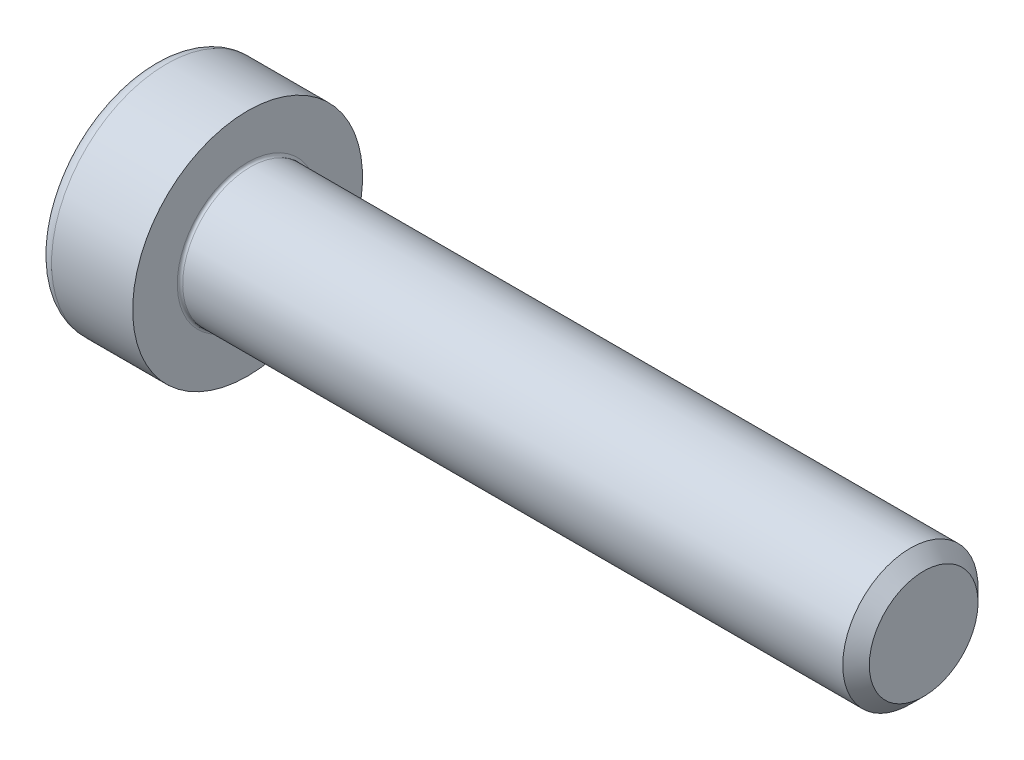
ISO-10303-21;
HEADER;
FILE_DESCRIPTION(('STEP AP214'),'2;1');
FILE_NAME('part.step','',(''),(''),'','','');
FILE_SCHEMA(('AUTOMOTIVE_DESIGN { 1 0 10303 214 1 1 1 1 }'));
ENDSEC;
DATA;
#1=APPLICATION_CONTEXT('core data for automotive mechanical design processes');
#2=APPLICATION_PROTOCOL_DEFINITION('international standard','automotive_design',2000,#1);
#3=PRODUCT_CONTEXT('',#1,'mechanical');
#4=PRODUCT('Part','Part','',(#3));
#5=PRODUCT_RELATED_PRODUCT_CATEGORY('part','',(#4));
#6=PRODUCT_DEFINITION_FORMATION('','',#4);
#7=PRODUCT_DEFINITION_CONTEXT('part definition',#1,'design');
#8=PRODUCT_DEFINITION('design','',#6,#7);
#9=PRODUCT_DEFINITION_SHAPE('','',#8);
#10=(LENGTH_UNIT() NAMED_UNIT(*) SI_UNIT(.MILLI.,.METRE.));
#11=(NAMED_UNIT(*) PLANE_ANGLE_UNIT() SI_UNIT($,.RADIAN.));
#12=(NAMED_UNIT(*) SI_UNIT($,.STERADIAN.) SOLID_ANGLE_UNIT());
#13=UNCERTAINTY_MEASURE_WITH_UNIT(LENGTH_MEASURE(1.E-05),#10,'distance_accuracy_value','');
#14=(GEOMETRIC_REPRESENTATION_CONTEXT(3) GLOBAL_UNCERTAINTY_ASSIGNED_CONTEXT((#13)) GLOBAL_UNIT_ASSIGNED_CONTEXT((#10,
#11,#12)) REPRESENTATION_CONTEXT('',''));
#15=CARTESIAN_POINT('',(0.,0.,0.));
#16=DIRECTION('',(0.,0.,1.));
#17=DIRECTION('',(1.,0.,0.));
#18=AXIS2_PLACEMENT_3D('',#15,#16,#17);
#19=CARTESIAN_POINT('',(-3.5,-1.5,0.866025403784439));
#20=DIRECTION('',(0.,-0.5,0.866025403784439));
#21=DIRECTION('',(0.,-0.866025403784439,-0.5));
#22=AXIS2_PLACEMENT_3D('',#19,#20,#21);
#23=PLANE('',#22);
#24=DIRECTION('',(1.,0.,0.));
#25=VECTOR('',#24,1.);
#26=CARTESIAN_POINT('',(-3.5,-1.5,0.866025403784438));
#27=LINE('',#26,#25);
#28=CARTESIAN_POINT('',(-0.799999985621517,-1.49999995696126,0.866025428632867));
#29=VERTEX_POINT('',#28);
#30=CARTESIAN_POINT('',(-3.5,-1.5,0.866025403784438));
#31=VERTEX_POINT('',#30);
#32=EDGE_CURVE('E80',#29,#31,#27,.F.);
#33=ORIENTED_EDGE('',*,*,#32,.T.);
#34=DIRECTION('',(0.,-0.866025403784439,-0.5));
#35=VECTOR('',#34,1.);
#36=CARTESIAN_POINT('',(-3.5,-1.5,0.866025403784439));
#37=LINE('',#36,#35);
#38=CARTESIAN_POINT('',(-3.5,0.,1.73205080756888));
#39=VERTEX_POINT('',#38);
#40=EDGE_CURVE('E92',#39,#31,#37,.T.);
#41=ORIENTED_EDGE('',*,*,#40,.F.);
#42=DIRECTION('',(1.,0.,0.));
#43=VECTOR('',#42,1.);
#44=CARTESIAN_POINT('',(-3.5,0.,1.73205080756888));
#45=LINE('',#44,#43);
#46=CARTESIAN_POINT('',(-0.799999997599108,7.10597112544528E-09,1.73205080346625));
#47=VERTEX_POINT('',#46);
#48=EDGE_CURVE('E75',#39,#47,#45,.T.);
#49=ORIENTED_EDGE('',*,*,#48,.T.);
#50=CARTESIAN_POINT('',(-0.79999999523045,-1.42119404923263E-08,1.73205079936361));
#51=CARTESIAN_POINT('',(-0.778021654471843,-0.0659159296217276,1.69399422785789));
#52=CARTESIAN_POINT('',(-0.758033503871372,-0.132400830276045,1.65560915256807));
#53=CARTESIAN_POINT('',(-0.723144787463203,-0.26652177314378,1.57817439009942));
#54=CARTESIAN_POINT('',(-0.708256562613244,-0.334160197650861,1.53912332750269));
#55=CARTESIAN_POINT('',(-0.685081967437948,-0.468598837632633,1.46150514251973));
#56=CARTESIAN_POINT('',(-0.676641339355387,-0.535378373795371,1.42294995933982));
#57=CARTESIAN_POINT('',(-0.666566875590513,-0.669251501943529,1.34565827276622));
#58=CARTESIAN_POINT('',(-0.664924695379553,-0.736344607670474,1.306922050114));
#59=CARTESIAN_POINT('',(-0.668349717996232,-0.861700870344839,1.23454757811435));
#60=CARTESIAN_POINT('',(-0.672575963675073,-0.919982838042039,1.20089846837547));
#61=CARTESIAN_POINT('',(-0.685967972738203,-1.0361670854908,1.13381946183533));
#62=CARTESIAN_POINT('',(-0.695138306326933,-1.09406896369226,1.10038979686913));
#63=CARTESIAN_POINT('',(-0.718062365209915,-1.21049256160201,1.03317260127592));
#64=CARTESIAN_POINT('',(-0.731913218733098,-1.26899955377169,0.999393573597279));
#65=CARTESIAN_POINT('',(-0.763348800640084,-1.38514115887701,0.932339186625603));
#66=CARTESIAN_POINT('',(-0.780926147657234,-1.44277725857226,0.899062968951514));
#67=CARTESIAN_POINT('',(-0.799999971937719,-1.49999991590986,0.866025452333902));
#68=B_SPLINE_CURVE_WITH_KNOTS('',3,(#50,#51,#52,#53,#54,#55,#56,#57,#58,#59,#60,#61,#62,#63,#64,
#65,#66,#67),.UNSPECIFIED.,.F.,.F.,(4,2,2,2,2,2,2,2,4),(0.,0.237762007462691,0.476095360319189,
0.708530701230575,0.940680662376142,1.14278080497579,1.34506808554378,1.55184112780972,
1.75820836204339),.UNSPECIFIED.);
#69=EDGE_CURVE('E20',#47,#29,#68,.T.);
#70=ORIENTED_EDGE('',*,*,#69,.T.);
#71=EDGE_LOOP('',(#33,#41,#49,#70));
#72=FACE_BOUND('',#71,.T.);
#73=ADVANCED_FACE('F16',(#72),#23,.F.);
#74=CARTESIAN_POINT('',(-3.5,-1.5,-0.866025403784438));
#75=DIRECTION('',(0.,-1.,0.));
#76=DIRECTION('',(0.,0.,-1.));
#77=AXIS2_PLACEMENT_3D('',#74,#75,#76);
#78=PLANE('',#77);
#79=DIRECTION('',(1.,0.,0.));
#80=VECTOR('',#79,1.);
#81=CARTESIAN_POINT('',(-3.5,-1.5,-0.866025403784441));
#82=LINE('',#81,#80);
#83=CARTESIAN_POINT('',(-0.799999985618855,-1.5,-0.86602535407836));
#84=VERTEX_POINT('',#83);
#85=CARTESIAN_POINT('',(-3.5,-1.5,-0.86602540378444));
#86=VERTEX_POINT('',#85);
#87=EDGE_CURVE('E256',#84,#86,#82,.F.);
#88=ORIENTED_EDGE('',*,*,#87,.T.);
#89=DIRECTION('',(0.,0.,-1.));
#90=VECTOR('',#89,1.);
#91=CARTESIAN_POINT('',(-3.5,-1.5,-0.866025403784438));
#92=LINE('',#91,#90);
#93=EDGE_CURVE('E91',#31,#86,#92,.T.);
#94=ORIENTED_EDGE('',*,*,#93,.F.);
#95=ORIENTED_EDGE('',*,*,#32,.F.);
#96=CARTESIAN_POINT('',(-0.80000001920602,-1.5,0.866025470427717));
#97=CARTESIAN_POINT('',(-0.77802167648586,-1.5,0.789912326041712));
#98=CARTESIAN_POINT('',(-0.758033523800099,-1.5,0.713142174078841));
#99=CARTESIAN_POINT('',(-0.723144803060219,-1.5,0.55827264624065));
#100=CARTESIAN_POINT('',(-0.708256575966329,-1.5,0.480170519528706));
#101=CARTESIAN_POINT('',(-0.685081976340173,-1.5,0.324934146528534));
#102=CARTESIAN_POINT('',(-0.676641346041877,-1.5,0.247823778658389));
#103=CARTESIAN_POINT('',(-0.666566877999725,-1.5,0.0932404023138473));
#104=CARTESIAN_POINT('',(-0.664924695725642,-1.5,0.0157679553227043));
#105=CARTESIAN_POINT('',(-0.668349714916647,-1.5,-0.128980995727346));
#106=CARTESIAN_POINT('',(-0.672575959480197,-1.5,-0.196279220540902));
#107=CARTESIAN_POINT('',(-0.685967967205316,-1.5,-0.330437244310137));
#108=CARTESIAN_POINT('',(-0.695138300573279,-1.5,-0.397296579595575));
#109=CARTESIAN_POINT('',(-0.718062359837834,-1.5,-0.531730981678525));
#110=CARTESIAN_POINT('',(-0.731913213992151,-1.5,-0.599289042575244));
#111=CARTESIAN_POINT('',(-0.763348797819926,-1.5,-0.733397827426864));
#112=CARTESIAN_POINT('',(-0.780926146124088,-1.5,-0.799950268144442));
#113=CARTESIAN_POINT('',(-0.799999971931641,-1.5,-0.86602530666446));
#114=B_SPLINE_CURVE_WITH_KNOTS('',3,(#96,#97,#98,#99,#100,#101,#102,#103,#104,#105,#106,#107,
#108,#109,#110,#111,#112,#113),.UNSPECIFIED.,.F.,.F.,(4,2,2,2,2,2,2,2,4),(0.,0.237762013065174,
0.476095371669085,0.708530717809134,0.940680684129143,1.14278084244057,1.34506813878101,
1.55184119767437,1.75820844842924),.UNSPECIFIED.);
#115=EDGE_CURVE('E85',#29,#84,#114,.T.);
#116=ORIENTED_EDGE('',*,*,#115,.T.);
#117=EDGE_LOOP('',(#88,#94,#95,#116));
#118=FACE_BOUND('',#117,.T.);
#119=ADVANCED_FACE('F89',(#118),#78,.F.);
#120=CARTESIAN_POINT('',(-3.5,0.,1.73205080756888));
#121=DIRECTION('',(0.,0.500000000000001,0.866025403784438));
#122=DIRECTION('',(0.,-0.866025403784438,0.500000000000001));
#123=AXIS2_PLACEMENT_3D('',#120,#121,#122);
#124=PLANE('',#123);
#125=ORIENTED_EDGE('',*,*,#48,.F.);
#126=DIRECTION('',(0.,-0.866025403784438,0.500000000000001));
#127=VECTOR('',#126,1.);
#128=CARTESIAN_POINT('',(-3.5,0.,1.73205080756888));
#129=LINE('',#128,#127);
#130=CARTESIAN_POINT('',(-3.5,1.5,0.866025403784438));
#131=VERTEX_POINT('',#130);
#132=EDGE_CURVE('E264',#131,#39,#129,.T.);
#133=ORIENTED_EDGE('',*,*,#132,.F.);
#134=DIRECTION('',(1.,0.,0.));
#135=VECTOR('',#134,1.);
#136=CARTESIAN_POINT('',(-3.5,1.5,0.866025403784437));
#137=LINE('',#136,#135);
#138=CARTESIAN_POINT('',(-0.799999985617244,1.5,0.866025354072781));
#139=VERTEX_POINT('',#138);
#140=EDGE_CURVE('E86',#131,#139,#137,.T.);
#141=ORIENTED_EDGE('',*,*,#140,.T.);
#142=CARTESIAN_POINT('',(-0.800000019194172,1.50000005767922,0.866025370483324));
#143=CARTESIAN_POINT('',(-0.778021676467504,1.43408414105691,0.904081942689099));
#144=CARTESIAN_POINT('',(-0.758033523776554,1.36759923918227,0.942467018683468));
#145=CARTESIAN_POINT('',(-0.723144803029528,1.23347829375395,1.01990178263048));
#146=CARTESIAN_POINT('',(-0.708256575933912,1.16583986790583,1.05895284600145));
#147=CARTESIAN_POINT('',(-0.685081976318737,1.03140122529361,1.13657103250311));
#148=CARTESIAN_POINT('',(-0.676641346028541,0.964621687846786,1.17512621642439));
#149=CARTESIAN_POINT('',(-0.666566877996918,0.830748556981707,1.2524179045666));
#150=CARTESIAN_POINT('',(-0.664924695725045,0.76365544982222,1.2911541280459));
#151=CARTESIAN_POINT('',(-0.668349715080408,0.638299175166305,1.3635286069631));
#152=CARTESIAN_POINT('',(-0.672575960340761,0.580017196957215,1.39717772277102));
#153=CARTESIAN_POINT('',(-0.68596797041692,0.463832928567564,1.46425674140138));
#154=CARTESIAN_POINT('',(-0.69513830544139,0.405931039937444,1.49768641238857));
#155=CARTESIAN_POINT('',(-0.718062368835887,0.2895074208714,1.56490362019638));
#156=CARTESIAN_POINT('',(-0.73191322549354,0.231000417983331,1.59868265406329));
#157=CARTESIAN_POINT('',(-0.763348814872164,0.114858791804426,1.6657370532018));
#158=CARTESIAN_POINT('',(-0.780926166220527,0.0572226817527214,1.69901327685519));
#159=CARTESIAN_POINT('',(-0.799999995230451,1.42119421437414E-08,1.73205079936361));
#160=B_SPLINE_CURVE_WITH_KNOTS('',3,(#142,#143,#144,#145,#146,#147,#148,#149,#150,#151,#152,
#153,#154,#155,#156,#157,#158,#159),.UNSPECIFIED.,.F.,.F.,(4,2,2,2,2,2,2,2,4),(0.,
0.237762013144064,0.476095371837281,0.70853071789167,0.940680684118433,1.14278086286583,
1.34506817971784,1.55184126018789,1.75820853235518),.UNSPECIFIED.);
#161=EDGE_CURVE('E124',#139,#47,#160,.T.);
#162=ORIENTED_EDGE('',*,*,#161,.T.);
#163=EDGE_LOOP('',(#125,#133,#141,#162));
#164=FACE_BOUND('',#163,.T.);
#165=ADVANCED_FACE('F117',(#164),#124,.F.);
#166=CARTESIAN_POINT('',(-3.5,0.,-1.73205080756888));
#167=DIRECTION('',(0.,-0.5,-0.866025403784439));
#168=DIRECTION('',(0.,0.866025403784439,-0.5));
#169=AXIS2_PLACEMENT_3D('',#166,#167,#168);
#170=PLANE('',#169);
#171=DIRECTION('',(1.,0.,0.));
#172=VECTOR('',#171,1.);
#173=CARTESIAN_POINT('',(-3.5,0.,-1.73205080756888));
#174=LINE('',#173,#172);
#175=CARTESIAN_POINT('',(-0.79999999228092,-5.19199613850443E-08,-1.73205079425487));
#176=VERTEX_POINT('',#175);
#177=CARTESIAN_POINT('',(-3.5,0.,-1.73205080756888));
#178=VERTEX_POINT('',#177);
#179=EDGE_CURVE('E130',#176,#178,#174,.F.);
#180=ORIENTED_EDGE('',*,*,#179,.T.);
#181=DIRECTION('',(0.,0.866025403784439,-0.5));
#182=VECTOR('',#181,1.);
#183=CARTESIAN_POINT('',(-3.5,0.,-1.73205080756888));
#184=LINE('',#183,#182);
#185=EDGE_CURVE('E40',#86,#178,#184,.T.);
#186=ORIENTED_EDGE('',*,*,#185,.F.);
#187=ORIENTED_EDGE('',*,*,#87,.F.);
#188=CARTESIAN_POINT('',(-0.800000019198761,-1.50000005769299,-0.866025370475378));
#189=CARTESIAN_POINT('',(-0.778021676478219,-1.43408414109019,-0.904081942669885));
#190=CARTESIAN_POINT('',(-0.758033523792277,-1.36759923923531,-0.942467018652845));
#191=CARTESIAN_POINT('',(-0.723144803052496,-1.23347829384962,-1.01990178257524));
#192=CARTESIAN_POINT('',(-0.708256575958915,-1.16583986802441,-1.05895284593299));
#193=CARTESIAN_POINT('',(-0.685081976335254,-1.03140122541517,-1.13657103243292));
#194=CARTESIAN_POINT('',(-0.676641346038544,-0.964621687947897,-1.17512621636601));
#195=CARTESIAN_POINT('',(-0.666566877998786,-0.830748557038212,-1.25241790453398));
#196=CARTESIAN_POINT('',(-0.664924695725483,-0.763655449854568,-1.29115412802722));
#197=CARTESIAN_POINT('',(-0.668349714938769,-0.638299180308248,-1.3635286039944));
#198=CARTESIAN_POINT('',(-0.672575959593581,-0.580017207221903,-1.3971777168447));
#199=CARTESIAN_POINT('',(-0.685967967626045,-0.463832948992604,-1.46425672960898));
#200=CARTESIAN_POINT('',(-0.695138301210386,-0.405931065399888,-1.49768639768782));
#201=CARTESIAN_POINT('',(-0.718062361014187,-0.289507456525243,-1.56490359961163));
#202=CARTESIAN_POINT('',(-0.731913215495269,-0.231000458786165,-1.59868263050576));
#203=CARTESIAN_POINT('',(-0.763348800047481,-0.114858842717895,-1.66573702380689));
#204=CARTESIAN_POINT('',(-0.780926148748883,-0.0572227376285118,-1.69901324459529));
#205=CARTESIAN_POINT('',(-0.799999974974276,-7.49804692460897E-08,-1.73205076427889));
#206=B_SPLINE_CURVE_WITH_KNOTS('',3,(#188,#189,#190,#191,#192,#193,#194,#195,#196,#197,#198,
#199,#200,#201,#202,#203,#204,#205),.UNSPECIFIED.,.F.,.F.,(4,2,2,2,2,2,2,2,4),(0.,
0.237762013074141,0.476095371688346,0.708530717815963,0.940680684122562,1.14278084509902,
1.34506814411434,1.55184120582147,1.75820845936869),.UNSPECIFIED.);
#207=EDGE_CURVE('E98',#84,#176,#206,.T.);
#208=ORIENTED_EDGE('',*,*,#207,.T.);
#209=EDGE_LOOP('',(#180,#186,#187,#208));
#210=FACE_BOUND('',#209,.T.);
#211=ADVANCED_FACE('F120',(#210),#170,.F.);
#212=CARTESIAN_POINT('',(-3.5,1.5,0.866025403784437));
#213=DIRECTION('',(0.,1.,0.));
#214=DIRECTION('',(0.,0.,1.));
#215=AXIS2_PLACEMENT_3D('',#212,#213,#214);
#216=PLANE('',#215);
#217=ORIENTED_EDGE('',*,*,#140,.F.);
#218=DIRECTION('',(0.,0.,1.));
#219=VECTOR('',#218,1.);
#220=CARTESIAN_POINT('',(-3.5,1.5,0.866025403784437));
#221=LINE('',#220,#219);
#222=CARTESIAN_POINT('',(-3.5,1.5,-0.86602540378444));
#223=VERTEX_POINT('',#222);
#224=EDGE_CURVE('E246',#223,#131,#221,.T.);
#225=ORIENTED_EDGE('',*,*,#224,.F.);
#226=DIRECTION('',(1.,0.,0.));
#227=VECTOR('',#226,1.);
#228=CARTESIAN_POINT('',(-3.5,1.5,-0.86602540378444));
#229=LINE('',#228,#227);
#230=CARTESIAN_POINT('',(-0.800000004777985,1.5,-0.866025420447538));
#231=VERTEX_POINT('',#230);
#232=EDGE_CURVE('E233',#223,#231,#229,.T.);
#233=ORIENTED_EDGE('',*,*,#232,.T.);
#234=CARTESIAN_POINT('',(-0.800000009591057,1.49999999999528,-0.866025437109814));
#235=CARTESIAN_POINT('',(-0.77802166765586,1.4999999999983,-0.789912293275434));
#236=CARTESIAN_POINT('',(-0.7580335158058,1.49999999999954,-0.713142141867382));
#237=CARTESIAN_POINT('',(-0.723144796802961,1.50000000000045,-0.558272615192524));
#238=CARTESIAN_POINT('',(-0.708256570609415,1.50000000000012,-0.480170489089434));
#239=CARTESIAN_POINT('',(-0.685081972768887,1.49999999999988,-0.324934117305971));
#240=CARTESIAN_POINT('',(-0.676641343359413,1.49999999999997,-0.247823750041499));
#241=CARTESIAN_POINT('',(-0.666566877033156,1.50000000000003,-0.0932403749791662));
#242=CARTESIAN_POINT('',(-0.664924695586781,1.50000000000001,-0.0157679286644265));
#243=CARTESIAN_POINT('',(-0.66834971615212,1.49999999999999,0.128981019555387));
#244=CARTESIAN_POINT('',(-0.672575961162931,1.5,0.196279242226448));
#245=CARTESIAN_POINT('',(-0.685967969424226,1.5,0.330437261703751));
#246=CARTESIAN_POINT('',(-0.69513830288032,1.5,0.3972965948398));
#247=CARTESIAN_POINT('',(-0.718062361990699,1.5,0.53173099254756));
#248=CARTESIAN_POINT('',(-0.731913215891151,1.5,0.599289051220098));
#249=CARTESIAN_POINT('',(-0.763348798946861,1.5,0.733397831691883));
#250=CARTESIAN_POINT('',(-0.780926146733885,1.5,0.799950270253574));
#251=CARTESIAN_POINT('',(-0.79999997192795,1.5,0.866025306651675));
#252=B_SPLINE_CURVE_WITH_KNOTS('',3,(#234,#235,#236,#237,#238,#239,#240,#241,#242,#243,#244,
#245,#246,#247,#248,#249,#250,#251),.UNSPECIFIED.,.F.,.F.,(4,2,2,2,2,2,2,2,4),(0.,
0.237762010818538,0.47609536711758,0.708530711160745,0.94068067540566,1.1427808274082,
1.34506811741536,1.55184116963225,1.75820841375334),.UNSPECIFIED.);
#253=EDGE_CURVE('E99',#231,#139,#252,.T.);
#254=ORIENTED_EDGE('',*,*,#253,.T.);
#255=EDGE_LOOP('',(#217,#225,#233,#254));
#256=FACE_BOUND('',#255,.T.);
#257=ADVANCED_FACE('F142',(#256),#216,.F.);
#258=CARTESIAN_POINT('',(-0.805999999954565,0.,0.));
#259=DIRECTION('',(-1.,0.,0.));
#260=DIRECTION('',(0.,0.,1.));
#261=AXIS2_PLACEMENT_3D('',#258,#259,#260);
#262=CONICAL_SURFACE('',#261,1.74244311239136,1.04719755119347);
#263=CARTESIAN_POINT('',(0.200000000006639,5.6843418860808E-11,0.));
#264=VERTEX_POINT('',#263);
#265=VERTEX_LOOP('',#264);
#266=FACE_BOUND('',#265,.T.);
#267=ORIENTED_EDGE('',*,*,#253,.F.);
#268=CARTESIAN_POINT('',(-0.799999987556277,1.4999999983015,-0.866025421417545));
#269=CARTESIAN_POINT('',(-0.778021652561019,1.43408407762367,-0.904081985293118));
#270=CARTESIAN_POINT('',(-0.758033504355957,1.36759917518167,-0.942467057237193));
#271=CARTESIAN_POINT('',(-0.723144789667161,1.2334782317236,-1.0199018168369));
#272=CARTESIAN_POINT('',(-0.708256564140513,1.16583980841997,-1.05895287992025));
#273=CARTESIAN_POINT('',(-0.685081968277753,1.03140116995701,-1.13657106486655));
#274=CARTESIAN_POINT('',(-0.676641340171634,0.964621634129466,-1.17512624754868));
#275=CARTESIAN_POINT('',(-0.666566876036259,0.830748506890652,-1.25241793337623));
#276=CARTESIAN_POINT('',(-0.664924695474878,0.763655401737834,-1.29115415577973));
#277=CARTESIAN_POINT('',(-0.668349717700705,0.638299129217241,-1.36352863351591));
#278=CARTESIAN_POINT('',(-0.672575964320051,0.580017151133725,-1.39717774923372));
#279=CARTESIAN_POINT('',(-0.685967976966546,0.463832883061417,-1.46425676766786));
#280=CARTESIAN_POINT('',(-0.695138313203807,0.405930994623284,-1.49768643854884));
#281=CARTESIAN_POINT('',(-0.718062378844431,0.289507376074144,-1.56490364606201));
#282=CARTESIAN_POINT('',(-0.731913236524033,0.231000373510667,-1.59868267974055));
#283=CARTESIAN_POINT('',(-0.763348827728675,0.114858748018946,-1.6657370784804));
#284=CARTESIAN_POINT('',(-0.780926179879473,0.0572226383294093,-1.69901330192374));
#285=CARTESIAN_POINT('',(-0.800000009587573,-2.88594274400154E-08,-1.73205082423088));
#286=B_SPLINE_CURVE_WITH_KNOTS('',3,(#268,#269,#270,#271,#272,#273,#274,#275,#276,#277,#278,
#279,#280,#281,#282,#283,#284,#285),.UNSPECIFIED.,.F.,.F.,(4,2,2,2,2,2,2,2,4),(0.,
0.237762005315108,0.476095356328078,0.708530695574836,0.940680654925048,1.14278083346443,
1.34506815017324,1.55184123016706,1.7582085017467),.UNSPECIFIED.);
#287=EDGE_CURVE('E131',#231,#176,#286,.T.);
#288=ORIENTED_EDGE('',*,*,#287,.T.);
#289=ORIENTED_EDGE('',*,*,#207,.F.);
#290=ORIENTED_EDGE('',*,*,#115,.F.);
#291=ORIENTED_EDGE('',*,*,#69,.F.);
#292=ORIENTED_EDGE('',*,*,#161,.F.);
#293=EDGE_LOOP('',(#267,#288,#289,#290,#291,#292));
#294=FACE_BOUND('',#293,.T.);
#295=ADVANCED_FACE('F96',(#266,#294),#262,.F.);
#296=CARTESIAN_POINT('',(-3.5,1.5,-0.86602540378444));
#297=DIRECTION('',(0.,0.5,-0.866025403784439));
#298=DIRECTION('',(0.,0.866025403784439,0.5));
#299=AXIS2_PLACEMENT_3D('',#296,#297,#298);
#300=PLANE('',#299);
#301=ORIENTED_EDGE('',*,*,#232,.F.);
#302=DIRECTION('',(0.,0.866025403784438,0.5));
#303=VECTOR('',#302,1.);
#304=CARTESIAN_POINT('',(-3.5,0.,-1.73205080756888));
#305=LINE('',#304,#303);
#306=EDGE_CURVE('E252',#178,#223,#305,.T.);
#307=ORIENTED_EDGE('',*,*,#306,.F.);
#308=ORIENTED_EDGE('',*,*,#179,.F.);
#309=ORIENTED_EDGE('',*,*,#287,.F.);
#310=EDGE_LOOP('',(#301,#307,#308,#309));
#311=FACE_BOUND('',#310,.T.);
#312=ADVANCED_FACE('F151',(#311),#300,.F.);
#313=CARTESIAN_POINT('',(-3.5,2.99102540378444,0.));
#314=DIRECTION('',(-1.,0.,0.));
#315=DIRECTION('',(0.,-1.,0.));
#316=AXIS2_PLACEMENT_3D('',#313,#314,#315);
#317=PLANE('',#316);
#318=ORIENTED_EDGE('',*,*,#185,.T.);
#319=ORIENTED_EDGE('',*,*,#306,.T.);
#320=ORIENTED_EDGE('',*,*,#224,.T.);
#321=ORIENTED_EDGE('',*,*,#132,.T.);
#322=ORIENTED_EDGE('',*,*,#40,.T.);
#323=ORIENTED_EDGE('',*,*,#93,.T.);
#324=EDGE_LOOP('',(#318,#319,#320,#321,#322,#323));
#325=FACE_BOUND('',#324,.T.);
#326=CARTESIAN_POINT('',(-3.5,0.,0.));
#327=DIRECTION('',(1.,0.,0.));
#328=DIRECTION('',(0.,1.,0.));
#329=AXIS2_PLACEMENT_3D('',#326,#327,#328);
#330=CIRCLE('',#329,3.75);
#331=CARTESIAN_POINT('',(-3.5,3.75,0.));
#332=VERTEX_POINT('',#331);
#333=EDGE_CURVE('E220',#332,#332,#330,.T.);
#334=ORIENTED_EDGE('',*,*,#333,.F.);
#335=EDGE_LOOP('',(#334));
#336=FACE_BOUND('',#335,.T.);
#337=ADVANCED_FACE('F207',(#325,#336),#317,.T.);
#338=CARTESIAN_POINT('',(-3.,0.,0.));
#339=DIRECTION('',(1.,0.,0.));
#340=DIRECTION('',(0.,0.,-1.));
#341=AXIS2_PLACEMENT_3D('',#338,#339,#340);
#342=TOROIDAL_SURFACE('',#341,3.75,0.5);
#343=CARTESIAN_POINT('',(-3.,0.,0.));
#344=DIRECTION('',(1.,0.,0.));
#345=DIRECTION('',(0.,1.,0.));
#346=AXIS2_PLACEMENT_3D('',#343,#344,#345);
#347=CIRCLE('',#346,4.25);
#348=CARTESIAN_POINT('',(-3.,4.25,0.));
#349=VERTEX_POINT('',#348);
#350=EDGE_CURVE('E285',#349,#349,#347,.T.);
#351=ORIENTED_EDGE('',*,*,#350,.F.);
#352=EDGE_LOOP('',(#351));
#353=FACE_BOUND('',#352,.T.);
#354=ORIENTED_EDGE('',*,*,#333,.T.);
#355=EDGE_LOOP('',(#354));
#356=FACE_BOUND('',#355,.T.);
#357=ADVANCED_FACE('F201',(#353,#356),#342,.T.);
#358=CARTESIAN_POINT('',(-1.75,0.,0.));
#359=DIRECTION('',(1.,0.,0.));
#360=DIRECTION('',(0.,1.,0.));
#361=AXIS2_PLACEMENT_3D('',#358,#359,#360);
#362=CYLINDRICAL_SURFACE('',#361,4.25);
#363=ORIENTED_EDGE('',*,*,#350,.T.);
#364=EDGE_LOOP('',(#363));
#365=FACE_BOUND('',#364,.T.);
#366=CARTESIAN_POINT('',(0.,0.,0.));
#367=DIRECTION('',(1.,0.,0.));
#368=DIRECTION('',(0.,1.,0.));
#369=AXIS2_PLACEMENT_3D('',#366,#367,#368);
#370=CIRCLE('',#369,4.25);
#371=CARTESIAN_POINT('',(0.,4.25,0.));
#372=VERTEX_POINT('',#371);
#373=EDGE_CURVE('E281',#372,#372,#370,.T.);
#374=ORIENTED_EDGE('',*,*,#373,.F.);
#375=EDGE_LOOP('',(#374));
#376=FACE_BOUND('',#375,.T.);
#377=ADVANCED_FACE('F197',(#365,#376),#362,.T.);
#378=CARTESIAN_POINT('',(25.,1.25,0.));
#379=DIRECTION('',(1.,0.,0.));
#380=DIRECTION('',(0.,1.,0.));
#381=AXIS2_PLACEMENT_3D('',#378,#379,#380);
#382=PLANE('',#381);
#383=CARTESIAN_POINT('',(24.9999999999773,0.,0.));
#384=DIRECTION('',(-1.,0.,0.));
#385=DIRECTION('',(0.,0.,1.));
#386=AXIS2_PLACEMENT_3D('',#383,#384,#385);
#387=CIRCLE('',#386,2.00924000000668);
#388=CARTESIAN_POINT('',(24.9999999999773,0.,2.00924000000668));
#389=VERTEX_POINT('',#388);
#390=EDGE_CURVE('E278',#389,#389,#387,.T.);
#391=ORIENTED_EDGE('',*,*,#390,.F.);
#392=EDGE_LOOP('',(#391));
#393=FACE_BOUND('',#392,.T.);
#394=ADVANCED_FACE('F194',(#393),#382,.T.);
#395=CARTESIAN_POINT('',(0.,3.375,0.));
#396=DIRECTION('',(1.,0.,0.));
#397=DIRECTION('',(0.,1.,0.));
#398=AXIS2_PLACEMENT_3D('',#395,#396,#397);
#399=PLANE('',#398);
#400=CARTESIAN_POINT('',(0.,0.,0.));
#401=DIRECTION('',(1.,0.,0.));
#402=DIRECTION('',(0.,1.,0.));
#403=AXIS2_PLACEMENT_3D('',#400,#401,#402);
#404=CIRCLE('',#403,2.6);
#405=CARTESIAN_POINT('',(0.,2.6,0.));
#406=VERTEX_POINT('',#405);
#407=EDGE_CURVE('E181',#406,#406,#404,.F.);
#408=ORIENTED_EDGE('',*,*,#407,.T.);
#409=EDGE_LOOP('',(#408));
#410=FACE_BOUND('',#409,.T.);
#411=ORIENTED_EDGE('',*,*,#373,.T.);
#412=EDGE_LOOP('',(#411));
#413=FACE_BOUND('',#412,.T.);
#414=ADVANCED_FACE('F185',(#410,#413),#399,.T.);
#415=CARTESIAN_POINT('',(24.5092399999862,0.,0.));
#416=DIRECTION('',(-1.,0.,0.));
#417=DIRECTION('',(0.,0.,1.));
#418=AXIS2_PLACEMENT_3D('',#415,#416,#417);
#419=CONICAL_SURFACE('',#418,2.50000000005457,0.785398163455362);
#420=ORIENTED_EDGE('',*,*,#390,.T.);
#421=EDGE_LOOP('',(#420));
#422=FACE_BOUND('',#421,.T.);
#423=CARTESIAN_POINT('',(24.50924,0.,0.));
#424=DIRECTION('',(1.,0.,0.));
#425=DIRECTION('',(0.,1.,0.));
#426=AXIS2_PLACEMENT_3D('',#423,#424,#425);
#427=CIRCLE('',#426,2.5);
#428=CARTESIAN_POINT('',(24.50924,2.5,0.));
#429=VERTEX_POINT('',#428);
#430=EDGE_CURVE('E31',#429,#429,#427,.F.);
#431=ORIENTED_EDGE('',*,*,#430,.F.);
#432=EDGE_LOOP('',(#431));
#433=FACE_BOUND('',#432,.T.);
#434=ADVANCED_FACE('F163',(#422,#433),#419,.T.);
#435=CARTESIAN_POINT('',(0.100000000000002,0.,0.));
#436=DIRECTION('',(1.,0.,0.));
#437=DIRECTION('',(0.,0.,-1.));
#438=AXIS2_PLACEMENT_3D('',#435,#436,#437);
#439=TOROIDAL_SURFACE('',#438,2.6,0.1);
#440=CARTESIAN_POINT('',(0.100000000000003,0.,0.));
#441=DIRECTION('',(1.,0.,0.));
#442=DIRECTION('',(0.,1.,0.));
#443=AXIS2_PLACEMENT_3D('',#440,#441,#442);
#444=CIRCLE('',#443,2.5);
#445=CARTESIAN_POINT('',(0.100000000000003,2.5,0.));
#446=VERTEX_POINT('',#445);
#447=EDGE_CURVE('E11',#446,#446,#444,.T.);
#448=ORIENTED_EDGE('',*,*,#447,.F.);
#449=EDGE_LOOP('',(#448));
#450=FACE_BOUND('',#449,.T.);
#451=ORIENTED_EDGE('',*,*,#407,.F.);
#452=EDGE_LOOP('',(#451));
#453=FACE_BOUND('',#452,.T.);
#454=ADVANCED_FACE('F157',(#450,#453),#439,.F.);
#455=CARTESIAN_POINT('',(13.7,0.,0.));
#456=DIRECTION('',(1.,0.,0.));
#457=DIRECTION('',(0.,1.,0.));
#458=AXIS2_PLACEMENT_3D('',#455,#456,#457);
#459=CYLINDRICAL_SURFACE('',#458,2.5);
#460=ORIENTED_EDGE('',*,*,#447,.T.);
#461=EDGE_LOOP('',(#460));
#462=FACE_BOUND('',#461,.T.);
#463=ORIENTED_EDGE('',*,*,#430,.T.);
#464=EDGE_LOOP('',(#463));
#465=FACE_BOUND('',#464,.T.);
#466=ADVANCED_FACE('F155',(#462,#465),#459,.T.);
#467=CLOSED_SHELL('',(#73,#119,#165,#211,#257,#295,#312,#337,#357,#377,#394,#414,#434,#454,#466));
#468=MANIFOLD_SOLID_BREP('B1',#467);
#469=ADVANCED_BREP_SHAPE_REPRESENTATION('',(#18,#468),#14);
#470=SHAPE_DEFINITION_REPRESENTATION(#9,#469);
ENDSEC;
END-ISO-10303-21;
